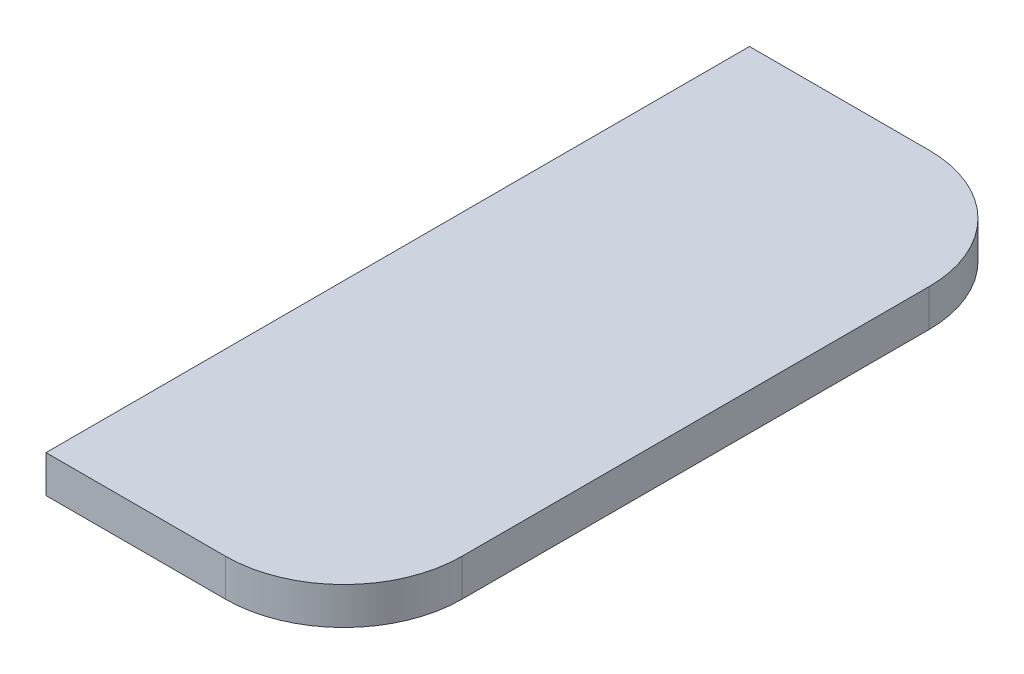
ISO-10303-21;
HEADER;
FILE_DESCRIPTION(('STEP AP214'),'2;1');
FILE_NAME('part.step','',(''),(''),'','','');
FILE_SCHEMA(('AUTOMOTIVE_DESIGN { 1 0 10303 214 1 1 1 1 }'));
ENDSEC;
DATA;
#1=APPLICATION_CONTEXT('core data for automotive mechanical design processes');
#2=APPLICATION_PROTOCOL_DEFINITION('international standard','automotive_design',2000,#1);
#3=PRODUCT_CONTEXT('',#1,'mechanical');
#4=PRODUCT('Part','Part','',(#3));
#5=PRODUCT_RELATED_PRODUCT_CATEGORY('part','',(#4));
#6=PRODUCT_DEFINITION_FORMATION('','',#4);
#7=PRODUCT_DEFINITION_CONTEXT('part definition',#1,'design');
#8=PRODUCT_DEFINITION('design','',#6,#7);
#9=PRODUCT_DEFINITION_SHAPE('','',#8);
#10=(LENGTH_UNIT() NAMED_UNIT(*) SI_UNIT(.MILLI.,.METRE.));
#11=(NAMED_UNIT(*) PLANE_ANGLE_UNIT() SI_UNIT($,.RADIAN.));
#12=(NAMED_UNIT(*) SI_UNIT($,.STERADIAN.) SOLID_ANGLE_UNIT());
#13=UNCERTAINTY_MEASURE_WITH_UNIT(LENGTH_MEASURE(1.E-05),#10,'distance_accuracy_value','');
#14=(GEOMETRIC_REPRESENTATION_CONTEXT(3) GLOBAL_UNCERTAINTY_ASSIGNED_CONTEXT((#13)) GLOBAL_UNIT_ASSIGNED_CONTEXT((#10,
#11,#12)) REPRESENTATION_CONTEXT('',''));
#15=CARTESIAN_POINT('',(0.,0.,0.));
#16=DIRECTION('',(0.,0.,1.));
#17=DIRECTION('',(1.,0.,0.));
#18=AXIS2_PLACEMENT_3D('',#15,#16,#17);
#19=CARTESIAN_POINT('',(-4.,1.,9.45));
#20=DIRECTION('',(1.,0.,0.));
#21=DIRECTION('',(0.,0.,-1.));
#22=AXIS2_PLACEMENT_3D('',#19,#20,#21);
#23=PLANE('',#22);
#24=DIRECTION('',(0.,0.,1.));
#25=VECTOR('',#24,1.);
#26=CARTESIAN_POINT('',(-4.,0.,9.45));
#27=LINE('',#26,#25);
#28=CARTESIAN_POINT('',(-4.,0.,-9.45));
#29=VERTEX_POINT('',#28);
#30=CARTESIAN_POINT('',(-4.,0.,9.45));
#31=VERTEX_POINT('',#30);
#32=EDGE_CURVE('E105',#29,#31,#27,.T.);
#33=ORIENTED_EDGE('',*,*,#32,.T.);
#34=DIRECTION('',(0.,-1.,0.));
#35=VECTOR('',#34,1.);
#36=CARTESIAN_POINT('',(-4.,1.,9.45));
#37=LINE('',#36,#35);
#38=CARTESIAN_POINT('',(-4.,1.,9.45));
#39=VERTEX_POINT('',#38);
#40=EDGE_CURVE('E88',#39,#31,#37,.T.);
#41=ORIENTED_EDGE('',*,*,#40,.F.);
#42=DIRECTION('',(0.,0.,1.));
#43=VECTOR('',#42,1.);
#44=CARTESIAN_POINT('',(-4.,1.,9.45));
#45=LINE('',#44,#43);
#46=CARTESIAN_POINT('',(-4.,1.,-9.45));
#47=VERTEX_POINT('',#46);
#48=EDGE_CURVE('E93',#47,#39,#45,.T.);
#49=ORIENTED_EDGE('',*,*,#48,.F.);
#50=DIRECTION('',(0.,-1.,0.));
#51=VECTOR('',#50,1.);
#52=CARTESIAN_POINT('',(-4.,1.,-9.45));
#53=LINE('',#52,#51);
#54=EDGE_CURVE('E107',#47,#29,#53,.T.);
#55=ORIENTED_EDGE('',*,*,#54,.T.);
#56=EDGE_LOOP('',(#33,#41,#49,#55));
#57=FACE_BOUND('',#56,.T.);
#58=ADVANCED_FACE('F32',(#57),#23,.F.);
#59=CARTESIAN_POINT('',(4.,1.,9.45));
#60=DIRECTION('',(0.,0.,-1.));
#61=DIRECTION('',(-1.,0.,0.));
#62=AXIS2_PLACEMENT_3D('',#59,#60,#61);
#63=PLANE('',#62);
#64=DIRECTION('',(1.,0.,0.));
#65=VECTOR('',#64,1.);
#66=CARTESIAN_POINT('',(4.,0.,9.45));
#67=LINE('',#66,#65);
#68=CARTESIAN_POINT('',(0.825,0.,9.45));
#69=VERTEX_POINT('',#68);
#70=EDGE_CURVE('E137',#31,#69,#67,.T.);
#71=ORIENTED_EDGE('',*,*,#70,.T.);
#72=DIRECTION('',(0.,-1.,0.));
#73=VECTOR('',#72,1.);
#74=CARTESIAN_POINT('',(0.825,1.,9.45));
#75=LINE('',#74,#73);
#76=CARTESIAN_POINT('',(0.825,1.,9.45));
#77=VERTEX_POINT('',#76);
#78=EDGE_CURVE('E11',#69,#77,#75,.F.);
#79=ORIENTED_EDGE('',*,*,#78,.T.);
#80=DIRECTION('',(1.,0.,0.));
#81=VECTOR('',#80,1.);
#82=CARTESIAN_POINT('',(4.,1.,9.45));
#83=LINE('',#82,#81);
#84=EDGE_CURVE('E84',#39,#77,#83,.T.);
#85=ORIENTED_EDGE('',*,*,#84,.F.);
#86=ORIENTED_EDGE('',*,*,#40,.T.);
#87=EDGE_LOOP('',(#71,#79,#85,#86));
#88=FACE_BOUND('',#87,.T.);
#89=ADVANCED_FACE('F86',(#88),#63,.F.);
#90=CARTESIAN_POINT('',(4.,1.,9.45));
#91=DIRECTION('',(-1.,0.,0.));
#92=DIRECTION('',(0.,0.,1.));
#93=AXIS2_PLACEMENT_3D('',#90,#91,#92);
#94=PLANE('',#93);
#95=DIRECTION('',(0.,0.,-1.));
#96=VECTOR('',#95,1.);
#97=CARTESIAN_POINT('',(4.,0.,9.45));
#98=LINE('',#97,#96);
#99=CARTESIAN_POINT('',(4.,0.,6.275));
#100=VERTEX_POINT('',#99);
#101=CARTESIAN_POINT('',(4.,0.,-6.275));
#102=VERTEX_POINT('',#101);
#103=EDGE_CURVE('E134',#100,#102,#98,.T.);
#104=ORIENTED_EDGE('',*,*,#103,.T.);
#105=DIRECTION('',(0.,-1.,0.));
#106=VECTOR('',#105,1.);
#107=CARTESIAN_POINT('',(4.,1.,-6.275));
#108=LINE('',#107,#106);
#109=CARTESIAN_POINT('',(4.,1.,-6.275));
#110=VERTEX_POINT('',#109);
#111=EDGE_CURVE('E53',#102,#110,#108,.F.);
#112=ORIENTED_EDGE('',*,*,#111,.T.);
#113=DIRECTION('',(0.,0.,-1.));
#114=VECTOR('',#113,1.);
#115=CARTESIAN_POINT('',(4.,1.,9.45));
#116=LINE('',#115,#114);
#117=CARTESIAN_POINT('',(4.,1.,6.275));
#118=VERTEX_POINT('',#117);
#119=EDGE_CURVE('E92',#118,#110,#116,.T.);
#120=ORIENTED_EDGE('',*,*,#119,.F.);
#121=DIRECTION('',(0.,-1.,0.));
#122=VECTOR('',#121,1.);
#123=CARTESIAN_POINT('',(4.,1.,6.275));
#124=LINE('',#123,#122);
#125=EDGE_CURVE('E118',#118,#100,#124,.T.);
#126=ORIENTED_EDGE('',*,*,#125,.T.);
#127=EDGE_LOOP('',(#104,#112,#120,#126));
#128=FACE_BOUND('',#127,.T.);
#129=ADVANCED_FACE('F135',(#128),#94,.F.);
#130=CARTESIAN_POINT('',(4.,1.,-9.45));
#131=DIRECTION('',(0.,0.,1.));
#132=DIRECTION('',(1.,0.,0.));
#133=AXIS2_PLACEMENT_3D('',#130,#131,#132);
#134=PLANE('',#133);
#135=DIRECTION('',(-1.,0.,0.));
#136=VECTOR('',#135,1.);
#137=CARTESIAN_POINT('',(4.,1.,-9.45));
#138=LINE('',#137,#136);
#139=CARTESIAN_POINT('',(0.825000000000001,1.,-9.45));
#140=VERTEX_POINT('',#139);
#141=EDGE_CURVE('E98',#140,#47,#138,.T.);
#142=ORIENTED_EDGE('',*,*,#141,.F.);
#143=DIRECTION('',(0.,-1.,0.));
#144=VECTOR('',#143,1.);
#145=CARTESIAN_POINT('',(0.825000000000001,1.,-9.45));
#146=LINE('',#145,#144);
#147=CARTESIAN_POINT('',(0.825000000000001,0.,-9.45));
#148=VERTEX_POINT('',#147);
#149=EDGE_CURVE('E106',#140,#148,#146,.T.);
#150=ORIENTED_EDGE('',*,*,#149,.T.);
#151=DIRECTION('',(-1.,0.,0.));
#152=VECTOR('',#151,1.);
#153=CARTESIAN_POINT('',(4.,0.,-9.45));
#154=LINE('',#153,#152);
#155=EDGE_CURVE('E102',#148,#29,#154,.T.);
#156=ORIENTED_EDGE('',*,*,#155,.T.);
#157=ORIENTED_EDGE('',*,*,#54,.F.);
#158=EDGE_LOOP('',(#142,#150,#156,#157));
#159=FACE_BOUND('',#158,.T.);
#160=ADVANCED_FACE('F127',(#159),#134,.F.);
#161=CARTESIAN_POINT('',(0.,1.,0.));
#162=DIRECTION('',(0.,1.,0.));
#163=DIRECTION('',(0.,0.,1.));
#164=AXIS2_PLACEMENT_3D('',#161,#162,#163);
#165=PLANE('',#164);
#166=ORIENTED_EDGE('',*,*,#119,.T.);
#167=CARTESIAN_POINT('',(0.825000000000001,1.,-6.275));
#168=DIRECTION('',(0.,1.,0.));
#169=DIRECTION('',(0.,0.,1.));
#170=AXIS2_PLACEMENT_3D('',#167,#168,#169);
#171=CIRCLE('',#170,3.175);
#172=EDGE_CURVE('E40',#110,#140,#171,.T.);
#173=ORIENTED_EDGE('',*,*,#172,.T.);
#174=ORIENTED_EDGE('',*,*,#141,.T.);
#175=ORIENTED_EDGE('',*,*,#48,.T.);
#176=ORIENTED_EDGE('',*,*,#84,.T.);
#177=CARTESIAN_POINT('',(0.825,1.,6.275));
#178=DIRECTION('',(0.,1.,0.));
#179=DIRECTION('',(0.,0.,1.));
#180=AXIS2_PLACEMENT_3D('',#177,#178,#179);
#181=CIRCLE('',#180,3.175);
#182=EDGE_CURVE('E122',#77,#118,#181,.T.);
#183=ORIENTED_EDGE('',*,*,#182,.T.);
#184=EDGE_LOOP('',(#166,#173,#174,#175,#176,#183));
#185=FACE_BOUND('',#184,.T.);
#186=ADVANCED_FACE('F96',(#185),#165,.T.);
#187=CARTESIAN_POINT('',(0.,0.,0.));
#188=DIRECTION('',(0.,1.,0.));
#189=DIRECTION('',(0.,0.,1.));
#190=AXIS2_PLACEMENT_3D('',#187,#188,#189);
#191=PLANE('',#190);
#192=ORIENTED_EDGE('',*,*,#155,.F.);
#193=CARTESIAN_POINT('',(0.825000000000001,0.,-6.275));
#194=DIRECTION('',(0.,1.,0.));
#195=DIRECTION('',(0.,0.,1.));
#196=AXIS2_PLACEMENT_3D('',#193,#194,#195);
#197=CIRCLE('',#196,3.175);
#198=EDGE_CURVE('E116',#148,#102,#197,.F.);
#199=ORIENTED_EDGE('',*,*,#198,.T.);
#200=ORIENTED_EDGE('',*,*,#103,.F.);
#201=CARTESIAN_POINT('',(0.825,0.,6.275));
#202=DIRECTION('',(0.,1.,0.));
#203=DIRECTION('',(0.,0.,1.));
#204=AXIS2_PLACEMENT_3D('',#201,#202,#203);
#205=CIRCLE('',#204,3.175);
#206=EDGE_CURVE('E110',#100,#69,#205,.F.);
#207=ORIENTED_EDGE('',*,*,#206,.T.);
#208=ORIENTED_EDGE('',*,*,#70,.F.);
#209=ORIENTED_EDGE('',*,*,#32,.F.);
#210=EDGE_LOOP('',(#192,#199,#200,#207,#208,#209));
#211=FACE_BOUND('',#210,.T.);
#212=ADVANCED_FACE('F133',(#211),#191,.F.);
#213=CARTESIAN_POINT('',(0.825000000000001,1.,-6.275));
#214=DIRECTION('',(0.,-1.,0.));
#215=DIRECTION('',(0.,0.,-1.));
#216=AXIS2_PLACEMENT_3D('',#213,#214,#215);
#217=CYLINDRICAL_SURFACE('',#216,3.175);
#218=ORIENTED_EDGE('',*,*,#172,.F.);
#219=ORIENTED_EDGE('',*,*,#111,.F.);
#220=ORIENTED_EDGE('',*,*,#198,.F.);
#221=ORIENTED_EDGE('',*,*,#149,.F.);
#222=EDGE_LOOP('',(#218,#219,#220,#221));
#223=FACE_BOUND('',#222,.T.);
#224=ADVANCED_FACE('F130',(#223),#217,.T.);
#225=CARTESIAN_POINT('',(0.825,1.,6.275));
#226=DIRECTION('',(0.,-1.,0.));
#227=DIRECTION('',(0.,0.,-1.));
#228=AXIS2_PLACEMENT_3D('',#225,#226,#227);
#229=CYLINDRICAL_SURFACE('',#228,3.175);
#230=ORIENTED_EDGE('',*,*,#182,.F.);
#231=ORIENTED_EDGE('',*,*,#78,.F.);
#232=ORIENTED_EDGE('',*,*,#206,.F.);
#233=ORIENTED_EDGE('',*,*,#125,.F.);
#234=EDGE_LOOP('',(#230,#231,#232,#233));
#235=FACE_BOUND('',#234,.T.);
#236=ADVANCED_FACE('F34',(#235),#229,.T.);
#237=CLOSED_SHELL('',(#58,#89,#129,#160,#186,#212,#224,#236));
#238=MANIFOLD_SOLID_BREP('B2',#237);
#239=ADVANCED_BREP_SHAPE_REPRESENTATION('',(#18,#238),#14);
#240=SHAPE_DEFINITION_REPRESENTATION(#9,#239);
ENDSEC;
END-ISO-10303-21;
